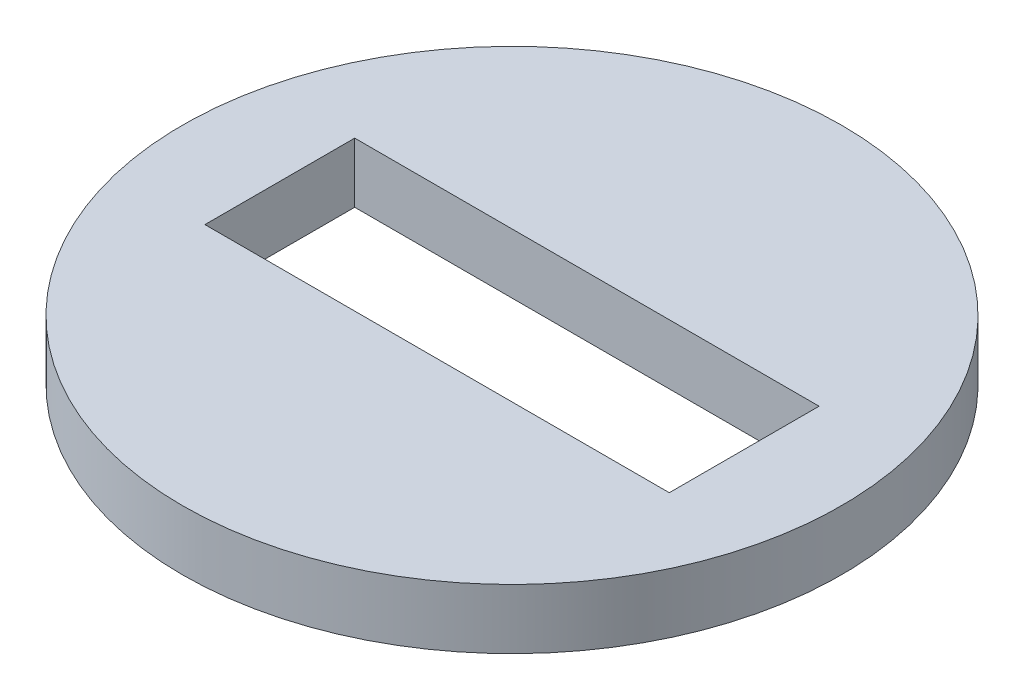
ISO-10303-21;
HEADER;
FILE_DESCRIPTION(('STEP AP214'),'2;1');
FILE_NAME('part.step','',(''),(''),'','','');
FILE_SCHEMA(('AUTOMOTIVE_DESIGN { 1 0 10303 214 1 1 1 1 }'));
ENDSEC;
DATA;
#1=APPLICATION_CONTEXT('core data for automotive mechanical design processes');
#2=APPLICATION_PROTOCOL_DEFINITION('international standard','automotive_design',2000,#1);
#3=PRODUCT_CONTEXT('',#1,'mechanical');
#4=PRODUCT('Part','Part','',(#3));
#5=PRODUCT_RELATED_PRODUCT_CATEGORY('part','',(#4));
#6=PRODUCT_DEFINITION_FORMATION('','',#4);
#7=PRODUCT_DEFINITION_CONTEXT('part definition',#1,'design');
#8=PRODUCT_DEFINITION('design','',#6,#7);
#9=PRODUCT_DEFINITION_SHAPE('','',#8);
#10=(LENGTH_UNIT() NAMED_UNIT(*) SI_UNIT(.MILLI.,.METRE.));
#11=(NAMED_UNIT(*) PLANE_ANGLE_UNIT() SI_UNIT($,.RADIAN.));
#12=(NAMED_UNIT(*) SI_UNIT($,.STERADIAN.) SOLID_ANGLE_UNIT());
#13=UNCERTAINTY_MEASURE_WITH_UNIT(LENGTH_MEASURE(1.E-05),#10,'distance_accuracy_value','');
#14=(GEOMETRIC_REPRESENTATION_CONTEXT(3) GLOBAL_UNCERTAINTY_ASSIGNED_CONTEXT((#13)) GLOBAL_UNIT_ASSIGNED_CONTEXT((#10,
#11,#12)) REPRESENTATION_CONTEXT('',''));
#15=CARTESIAN_POINT('',(0.,0.,0.));
#16=DIRECTION('',(0.,0.,1.));
#17=DIRECTION('',(1.,0.,0.));
#18=AXIS2_PLACEMENT_3D('',#15,#16,#17);
#19=CARTESIAN_POINT('',(0.,2.,0.));
#20=DIRECTION('',(0.,1.,0.));
#21=DIRECTION('',(0.,0.,1.));
#22=AXIS2_PLACEMENT_3D('',#19,#20,#21);
#23=PLANE('',#22);
#24=CARTESIAN_POINT('',(0.,2.,0.));
#25=DIRECTION('',(0.,1.,0.));
#26=DIRECTION('',(0.,0.,1.));
#27=AXIS2_PLACEMENT_3D('',#24,#25,#26);
#28=CIRCLE('',#27,11.);
#29=CARTESIAN_POINT('',(0.,2.,11.));
#30=VERTEX_POINT('',#29);
#31=EDGE_CURVE('E11',#30,#30,#28,.T.);
#32=ORIENTED_EDGE('',*,*,#31,.T.);
#33=EDGE_LOOP('',(#32));
#34=FACE_BOUND('',#33,.T.);
#35=DIRECTION('',(1.,0.,0.));
#36=VECTOR('',#35,1.);
#37=CARTESIAN_POINT('',(-7.75,2.,2.5));
#38=LINE('',#37,#36);
#39=CARTESIAN_POINT('',(-7.75,2.,2.5));
#40=VERTEX_POINT('',#39);
#41=CARTESIAN_POINT('',(7.75,2.,2.5));
#42=VERTEX_POINT('',#41);
#43=EDGE_CURVE('E83',#40,#42,#38,.T.);
#44=ORIENTED_EDGE('',*,*,#43,.F.);
#45=DIRECTION('',(0.,0.,1.));
#46=VECTOR('',#45,1.);
#47=CARTESIAN_POINT('',(-7.75,2.,-2.5));
#48=LINE('',#47,#46);
#49=CARTESIAN_POINT('',(-7.75,2.,-2.5));
#50=VERTEX_POINT('',#49);
#51=EDGE_CURVE('E75',#50,#40,#48,.T.);
#52=ORIENTED_EDGE('',*,*,#51,.F.);
#53=DIRECTION('',(-1.,0.,0.));
#54=VECTOR('',#53,1.);
#55=CARTESIAN_POINT('',(-7.75,2.,-2.5));
#56=LINE('',#55,#54);
#57=CARTESIAN_POINT('',(7.75,2.,-2.5));
#58=VERTEX_POINT('',#57);
#59=EDGE_CURVE('E96',#58,#50,#56,.T.);
#60=ORIENTED_EDGE('',*,*,#59,.F.);
#61=DIRECTION('',(0.,0.,-1.));
#62=VECTOR('',#61,1.);
#63=CARTESIAN_POINT('',(7.75,2.,-2.5));
#64=LINE('',#63,#62);
#65=EDGE_CURVE('E94',#42,#58,#64,.T.);
#66=ORIENTED_EDGE('',*,*,#65,.F.);
#67=EDGE_LOOP('',(#44,#52,#60,#66));
#68=FACE_BOUND('',#67,.T.);
#69=ADVANCED_FACE('F34',(#34,#68),#23,.T.);
#70=CARTESIAN_POINT('',(0.,0.,0.));
#71=DIRECTION('',(0.,1.,0.));
#72=DIRECTION('',(0.,0.,1.));
#73=AXIS2_PLACEMENT_3D('',#70,#71,#72);
#74=PLANE('',#73);
#75=CARTESIAN_POINT('',(0.,0.,0.));
#76=DIRECTION('',(0.,1.,0.));
#77=DIRECTION('',(0.,0.,1.));
#78=AXIS2_PLACEMENT_3D('',#75,#76,#77);
#79=CIRCLE('',#78,11.);
#80=CARTESIAN_POINT('',(0.,0.,11.));
#81=VERTEX_POINT('',#80);
#82=EDGE_CURVE('E38',#81,#81,#79,.T.);
#83=ORIENTED_EDGE('',*,*,#82,.F.);
#84=EDGE_LOOP('',(#83));
#85=FACE_BOUND('',#84,.T.);
#86=DIRECTION('',(0.,0.,1.));
#87=VECTOR('',#86,1.);
#88=CARTESIAN_POINT('',(-7.75,0.,-2.5));
#89=LINE('',#88,#87);
#90=CARTESIAN_POINT('',(-7.75,0.,-2.5));
#91=VERTEX_POINT('',#90);
#92=CARTESIAN_POINT('',(-7.75,0.,2.5));
#93=VERTEX_POINT('',#92);
#94=EDGE_CURVE('E57',#91,#93,#89,.T.);
#95=ORIENTED_EDGE('',*,*,#94,.T.);
#96=DIRECTION('',(1.,0.,0.));
#97=VECTOR('',#96,1.);
#98=CARTESIAN_POINT('',(-7.75,0.,2.5));
#99=LINE('',#98,#97);
#100=CARTESIAN_POINT('',(7.75,0.,2.5));
#101=VERTEX_POINT('',#100);
#102=EDGE_CURVE('E90',#93,#101,#99,.T.);
#103=ORIENTED_EDGE('',*,*,#102,.T.);
#104=DIRECTION('',(0.,0.,-1.));
#105=VECTOR('',#104,1.);
#106=CARTESIAN_POINT('',(7.75,0.,-2.5));
#107=LINE('',#106,#105);
#108=CARTESIAN_POINT('',(7.75,0.,-2.5));
#109=VERTEX_POINT('',#108);
#110=EDGE_CURVE('E102',#101,#109,#107,.T.);
#111=ORIENTED_EDGE('',*,*,#110,.T.);
#112=DIRECTION('',(-1.,0.,0.));
#113=VECTOR('',#112,1.);
#114=CARTESIAN_POINT('',(-7.75,0.,-2.5));
#115=LINE('',#114,#113);
#116=EDGE_CURVE('E84',#109,#91,#115,.T.);
#117=ORIENTED_EDGE('',*,*,#116,.T.);
#118=EDGE_LOOP('',(#95,#103,#111,#117));
#119=FACE_BOUND('',#118,.T.);
#120=ADVANCED_FACE('F113',(#85,#119),#74,.F.);
#121=CARTESIAN_POINT('',(0.,2.,0.));
#122=DIRECTION('',(0.,-1.,0.));
#123=DIRECTION('',(0.,0.,-1.));
#124=AXIS2_PLACEMENT_3D('',#121,#122,#123);
#125=CYLINDRICAL_SURFACE('',#124,11.);
#126=ORIENTED_EDGE('',*,*,#31,.F.);
#127=EDGE_LOOP('',(#126));
#128=FACE_BOUND('',#127,.T.);
#129=ORIENTED_EDGE('',*,*,#82,.T.);
#130=EDGE_LOOP('',(#129));
#131=FACE_BOUND('',#130,.T.);
#132=ADVANCED_FACE('F36',(#128,#131),#125,.T.);
#133=CARTESIAN_POINT('',(-7.75,2.,-2.5));
#134=DIRECTION('',(1.,0.,0.));
#135=DIRECTION('',(0.,0.,-1.));
#136=AXIS2_PLACEMENT_3D('',#133,#134,#135);
#137=PLANE('',#136);
#138=ORIENTED_EDGE('',*,*,#94,.F.);
#139=DIRECTION('',(0.,-1.,0.));
#140=VECTOR('',#139,1.);
#141=CARTESIAN_POINT('',(-7.75,2.,-2.5));
#142=LINE('',#141,#140);
#143=EDGE_CURVE('E79',#50,#91,#142,.T.);
#144=ORIENTED_EDGE('',*,*,#143,.F.);
#145=ORIENTED_EDGE('',*,*,#51,.T.);
#146=DIRECTION('',(0.,-1.,0.));
#147=VECTOR('',#146,1.);
#148=CARTESIAN_POINT('',(-7.75,2.,2.5));
#149=LINE('',#148,#147);
#150=EDGE_CURVE('E78',#40,#93,#149,.T.);
#151=ORIENTED_EDGE('',*,*,#150,.T.);
#152=EDGE_LOOP('',(#138,#144,#145,#151));
#153=FACE_BOUND('',#152,.T.);
#154=ADVANCED_FACE('F77',(#153),#137,.T.);
#155=CARTESIAN_POINT('',(-7.75,2.,2.5));
#156=DIRECTION('',(0.,0.,-1.));
#157=DIRECTION('',(-1.,0.,0.));
#158=AXIS2_PLACEMENT_3D('',#155,#156,#157);
#159=PLANE('',#158);
#160=ORIENTED_EDGE('',*,*,#102,.F.);
#161=ORIENTED_EDGE('',*,*,#150,.F.);
#162=ORIENTED_EDGE('',*,*,#43,.T.);
#163=DIRECTION('',(0.,-1.,0.));
#164=VECTOR('',#163,1.);
#165=CARTESIAN_POINT('',(7.75,2.,2.5));
#166=LINE('',#165,#164);
#167=EDGE_CURVE('E91',#42,#101,#166,.T.);
#168=ORIENTED_EDGE('',*,*,#167,.T.);
#169=EDGE_LOOP('',(#160,#161,#162,#168));
#170=FACE_BOUND('',#169,.T.);
#171=ADVANCED_FACE('F87',(#170),#159,.T.);
#172=CARTESIAN_POINT('',(7.75,2.,-2.5));
#173=DIRECTION('',(-1.,0.,0.));
#174=DIRECTION('',(0.,0.,1.));
#175=AXIS2_PLACEMENT_3D('',#172,#173,#174);
#176=PLANE('',#175);
#177=ORIENTED_EDGE('',*,*,#110,.F.);
#178=ORIENTED_EDGE('',*,*,#167,.F.);
#179=ORIENTED_EDGE('',*,*,#65,.T.);
#180=DIRECTION('',(0.,-1.,0.));
#181=VECTOR('',#180,1.);
#182=CARTESIAN_POINT('',(7.75,2.,-2.5));
#183=LINE('',#182,#181);
#184=EDGE_CURVE('E49',#58,#109,#183,.T.);
#185=ORIENTED_EDGE('',*,*,#184,.T.);
#186=EDGE_LOOP('',(#177,#178,#179,#185));
#187=FACE_BOUND('',#186,.T.);
#188=ADVANCED_FACE('F111',(#187),#176,.T.);
#189=CARTESIAN_POINT('',(-7.75,2.,-2.5));
#190=DIRECTION('',(0.,0.,1.));
#191=DIRECTION('',(1.,0.,0.));
#192=AXIS2_PLACEMENT_3D('',#189,#190,#191);
#193=PLANE('',#192);
#194=ORIENTED_EDGE('',*,*,#116,.F.);
#195=ORIENTED_EDGE('',*,*,#184,.F.);
#196=ORIENTED_EDGE('',*,*,#59,.T.);
#197=ORIENTED_EDGE('',*,*,#143,.T.);
#198=EDGE_LOOP('',(#194,#195,#196,#197));
#199=FACE_BOUND('',#198,.T.);
#200=ADVANCED_FACE('F114',(#199),#193,.T.);
#201=CLOSED_SHELL('',(#69,#120,#132,#154,#171,#188,#200));
#202=MANIFOLD_SOLID_BREP('B2',#201);
#203=ADVANCED_BREP_SHAPE_REPRESENTATION('',(#18,#202),#14);
#204=SHAPE_DEFINITION_REPRESENTATION(#9,#203);
ENDSEC;
END-ISO-10303-21;
